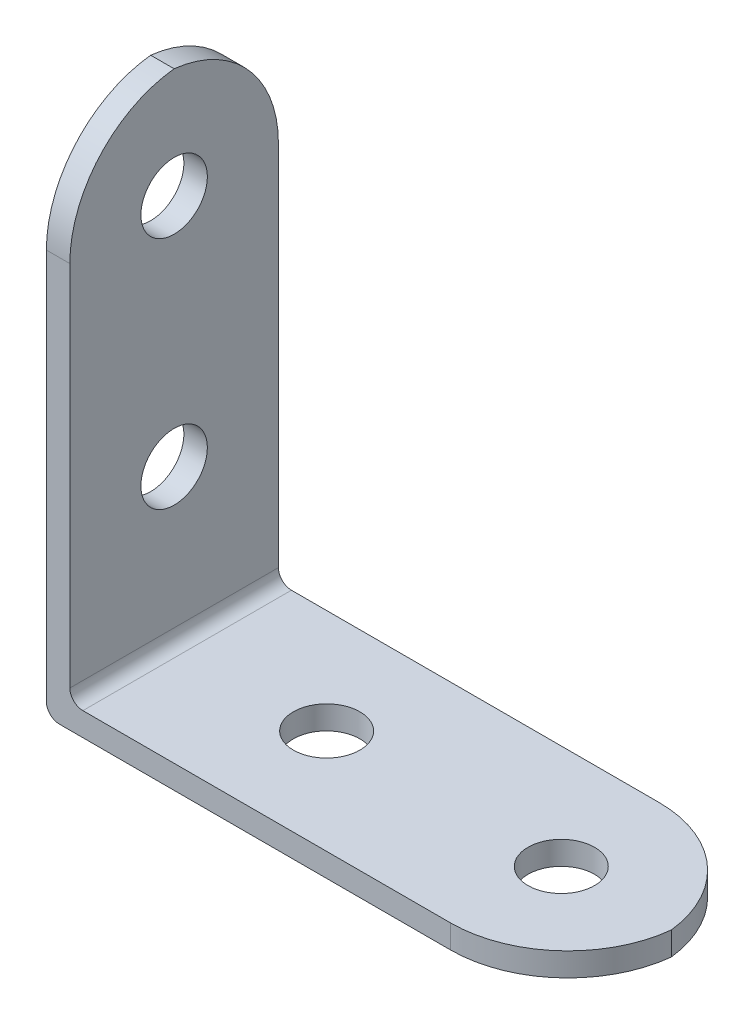
ISO-10303-21;
HEADER;
FILE_DESCRIPTION(('STEP AP214'),'2;1');
FILE_NAME('part.step','',(''),(''),'','','');
FILE_SCHEMA(('AUTOMOTIVE_DESIGN { 1 0 10303 214 1 1 1 1 }'));
ENDSEC;
DATA;
#1=APPLICATION_CONTEXT('core data for automotive mechanical design processes');
#2=APPLICATION_PROTOCOL_DEFINITION('international standard','automotive_design',2000,#1);
#3=PRODUCT_CONTEXT('',#1,'mechanical');
#4=PRODUCT('Part','Part','',(#3));
#5=PRODUCT_RELATED_PRODUCT_CATEGORY('part','',(#4));
#6=PRODUCT_DEFINITION_FORMATION('','',#4);
#7=PRODUCT_DEFINITION_CONTEXT('part definition',#1,'design');
#8=PRODUCT_DEFINITION('design','',#6,#7);
#9=PRODUCT_DEFINITION_SHAPE('','',#8);
#10=(LENGTH_UNIT() NAMED_UNIT(*) SI_UNIT(.MILLI.,.METRE.));
#11=(NAMED_UNIT(*) PLANE_ANGLE_UNIT() SI_UNIT($,.RADIAN.));
#12=(NAMED_UNIT(*) SI_UNIT($,.STERADIAN.) SOLID_ANGLE_UNIT());
#13=UNCERTAINTY_MEASURE_WITH_UNIT(LENGTH_MEASURE(1.E-05),#10,'distance_accuracy_value','');
#14=(GEOMETRIC_REPRESENTATION_CONTEXT(3) GLOBAL_UNCERTAINTY_ASSIGNED_CONTEXT((#13)) GLOBAL_UNIT_ASSIGNED_CONTEXT((#10,
#11,#12)) REPRESENTATION_CONTEXT('',''));
#15=CARTESIAN_POINT('',(0.,0.,0.));
#16=DIRECTION('',(0.,0.,1.));
#17=DIRECTION('',(1.,0.,0.));
#18=AXIS2_PLACEMENT_3D('',#15,#16,#17);
#19=CARTESIAN_POINT('',(1.8,0.,0.));
#20=DIRECTION('',(1.,0.,0.));
#21=DIRECTION('',(0.,0.,-1.));
#22=AXIS2_PLACEMENT_3D('',#19,#20,#21);
#23=PLANE('',#22);
#24=DIRECTION('',(0.,1.,0.));
#25=VECTOR('',#24,1.);
#26=CARTESIAN_POINT('',(1.8,0.,0.));
#27=LINE('',#26,#25);
#28=CARTESIAN_POINT('',(1.8,2.8,0.));
#29=VERTEX_POINT('',#28);
#30=CARTESIAN_POINT('',(1.8,31.,0.));
#31=VERTEX_POINT('',#30);
#32=EDGE_CURVE('E195',#29,#31,#27,.T.);
#33=ORIENTED_EDGE('',*,*,#32,.T.);
#34=CARTESIAN_POINT('',(1.8,31.,9.));
#35=DIRECTION('',(1.,0.,0.));
#36=DIRECTION('',(0.,0.,-1.));
#37=AXIS2_PLACEMENT_3D('',#34,#35,#36);
#38=CIRCLE('',#37,9.);
#39=CARTESIAN_POINT('',(1.8,39.9442719099992,8.));
#40=VERTEX_POINT('',#39);
#41=EDGE_CURVE('E173',#31,#40,#38,.T.);
#42=ORIENTED_EDGE('',*,*,#41,.T.);
#43=CARTESIAN_POINT('',(1.8,31.,7.));
#44=DIRECTION('',(1.,0.,0.));
#45=DIRECTION('',(0.,0.,-1.));
#46=AXIS2_PLACEMENT_3D('',#43,#44,#45);
#47=CIRCLE('',#46,9.);
#48=CARTESIAN_POINT('',(1.8,31.,16.));
#49=VERTEX_POINT('',#48);
#50=EDGE_CURVE('E171',#40,#49,#47,.T.);
#51=ORIENTED_EDGE('',*,*,#50,.T.);
#52=DIRECTION('',(0.,-1.,0.));
#53=VECTOR('',#52,1.);
#54=CARTESIAN_POINT('',(1.8,0.,16.));
#55=LINE('',#54,#53);
#56=CARTESIAN_POINT('',(1.8,2.8,16.));
#57=VERTEX_POINT('',#56);
#58=EDGE_CURVE('E194',#49,#57,#55,.T.);
#59=ORIENTED_EDGE('',*,*,#58,.T.);
#60=DIRECTION('',(0.,0.,1.));
#61=VECTOR('',#60,1.);
#62=CARTESIAN_POINT('',(1.8,2.8,0.));
#63=LINE('',#62,#61);
#64=EDGE_CURVE('E135',#57,#29,#63,.F.);
#65=ORIENTED_EDGE('',*,*,#64,.T.);
#66=EDGE_LOOP('',(#33,#42,#51,#59,#65));
#67=FACE_BOUND('',#66,.T.);
#68=CARTESIAN_POINT('',(1.8,31.5,8.));
#69=DIRECTION('',(1.,0.,0.));
#70=DIRECTION('',(0.,0.,-1.));
#71=AXIS2_PLACEMENT_3D('',#68,#69,#70);
#72=CIRCLE('',#71,2.55);
#73=CARTESIAN_POINT('',(1.8,31.5,5.45));
#74=VERTEX_POINT('',#73);
#75=EDGE_CURVE('E201',#74,#74,#72,.T.);
#76=ORIENTED_EDGE('',*,*,#75,.F.);
#77=EDGE_LOOP('',(#76));
#78=FACE_BOUND('',#77,.T.);
#79=CARTESIAN_POINT('',(1.8,13.5,8.));
#80=DIRECTION('',(1.,0.,0.));
#81=DIRECTION('',(0.,0.,-1.));
#82=AXIS2_PLACEMENT_3D('',#79,#80,#81);
#83=CIRCLE('',#82,2.55);
#84=CARTESIAN_POINT('',(1.8,13.5,5.45));
#85=VERTEX_POINT('',#84);
#86=EDGE_CURVE('E208',#85,#85,#83,.T.);
#87=ORIENTED_EDGE('',*,*,#86,.F.);
#88=EDGE_LOOP('',(#87));
#89=FACE_BOUND('',#88,.T.);
#90=ADVANCED_FACE('F39',(#67,#78,#89),#23,.T.);
#91=CARTESIAN_POINT('',(0.,0.,0.));
#92=DIRECTION('',(1.,0.,0.));
#93=DIRECTION('',(0.,0.,-1.));
#94=AXIS2_PLACEMENT_3D('',#91,#92,#93);
#95=PLANE('',#94);
#96=DIRECTION('',(0.,1.,0.));
#97=VECTOR('',#96,1.);
#98=CARTESIAN_POINT('',(0.,0.,0.));
#99=LINE('',#98,#97);
#100=CARTESIAN_POINT('',(0.,1.,0.));
#101=VERTEX_POINT('',#100);
#102=CARTESIAN_POINT('',(0.,31.,0.));
#103=VERTEX_POINT('',#102);
#104=EDGE_CURVE('E200',#101,#103,#99,.T.);
#105=ORIENTED_EDGE('',*,*,#104,.F.);
#106=DIRECTION('',(0.,0.,-1.));
#107=VECTOR('',#106,1.);
#108=CARTESIAN_POINT('',(0.,1.,0.));
#109=LINE('',#108,#107);
#110=CARTESIAN_POINT('',(0.,1.,16.));
#111=VERTEX_POINT('',#110);
#112=EDGE_CURVE('E47',#101,#111,#109,.F.);
#113=ORIENTED_EDGE('',*,*,#112,.T.);
#114=DIRECTION('',(0.,-1.,0.));
#115=VECTOR('',#114,1.);
#116=CARTESIAN_POINT('',(0.,0.,16.));
#117=LINE('',#116,#115);
#118=CARTESIAN_POINT('',(0.,31.,16.));
#119=VERTEX_POINT('',#118);
#120=EDGE_CURVE('E198',#119,#111,#117,.T.);
#121=ORIENTED_EDGE('',*,*,#120,.F.);
#122=CARTESIAN_POINT('',(0.,31.,7.));
#123=DIRECTION('',(1.,0.,0.));
#124=DIRECTION('',(0.,0.,-1.));
#125=AXIS2_PLACEMENT_3D('',#122,#123,#124);
#126=CIRCLE('',#125,9.);
#127=CARTESIAN_POINT('',(0.,39.9442719099992,8.));
#128=VERTEX_POINT('',#127);
#129=EDGE_CURVE('E166',#119,#128,#126,.F.);
#130=ORIENTED_EDGE('',*,*,#129,.T.);
#131=CARTESIAN_POINT('',(0.,31.,9.));
#132=DIRECTION('',(1.,0.,0.));
#133=DIRECTION('',(0.,0.,-1.));
#134=AXIS2_PLACEMENT_3D('',#131,#132,#133);
#135=CIRCLE('',#134,9.);
#136=EDGE_CURVE('E168',#128,#103,#135,.F.);
#137=ORIENTED_EDGE('',*,*,#136,.T.);
#138=EDGE_LOOP('',(#105,#113,#121,#130,#137));
#139=FACE_BOUND('',#138,.T.);
#140=CARTESIAN_POINT('',(0.,31.5,8.));
#141=DIRECTION('',(1.,0.,0.));
#142=DIRECTION('',(0.,0.,-1.));
#143=AXIS2_PLACEMENT_3D('',#140,#141,#142);
#144=CIRCLE('',#143,2.55);
#145=CARTESIAN_POINT('',(0.,31.5,5.45));
#146=VERTEX_POINT('',#145);
#147=EDGE_CURVE('E205',#146,#146,#144,.T.);
#148=ORIENTED_EDGE('',*,*,#147,.T.);
#149=EDGE_LOOP('',(#148));
#150=FACE_BOUND('',#149,.T.);
#151=CARTESIAN_POINT('',(0.,13.5,8.));
#152=DIRECTION('',(1.,0.,0.));
#153=DIRECTION('',(0.,0.,-1.));
#154=AXIS2_PLACEMENT_3D('',#151,#152,#153);
#155=CIRCLE('',#154,2.55);
#156=CARTESIAN_POINT('',(0.,13.5,5.45));
#157=VERTEX_POINT('',#156);
#158=EDGE_CURVE('E211',#157,#157,#155,.T.);
#159=ORIENTED_EDGE('',*,*,#158,.T.);
#160=EDGE_LOOP('',(#159));
#161=FACE_BOUND('',#160,.T.);
#162=ADVANCED_FACE('F257',(#139,#150,#161),#95,.F.);
#163=CARTESIAN_POINT('',(1.8,0.,0.));
#164=DIRECTION('',(0.,0.,1.));
#165=DIRECTION('',(0.,-1.,0.));
#166=AXIS2_PLACEMENT_3D('',#163,#164,#165);
#167=PLANE('',#166);
#168=DIRECTION('',(-1.,0.,0.));
#169=VECTOR('',#168,1.);
#170=CARTESIAN_POINT('',(1.8,0.,0.));
#171=LINE('',#170,#169);
#172=CARTESIAN_POINT('',(31.,0.,0.));
#173=VERTEX_POINT('',#172);
#174=CARTESIAN_POINT('',(1.,0.,0.));
#175=VERTEX_POINT('',#174);
#176=EDGE_CURVE('E145',#173,#175,#171,.T.);
#177=ORIENTED_EDGE('',*,*,#176,.T.);
#178=CARTESIAN_POINT('',(1.,1.,0.));
#179=DIRECTION('',(0.,0.,1.));
#180=DIRECTION('',(0.,-1.,0.));
#181=AXIS2_PLACEMENT_3D('',#178,#179,#180);
#182=CIRCLE('',#181,1.);
#183=EDGE_CURVE('E61',#175,#101,#182,.F.);
#184=ORIENTED_EDGE('',*,*,#183,.T.);
#185=ORIENTED_EDGE('',*,*,#104,.T.);
#186=DIRECTION('',(-1.,0.,0.));
#187=VECTOR('',#186,1.);
#188=CARTESIAN_POINT('',(1.8,31.,0.));
#189=LINE('',#188,#187);
#190=EDGE_CURVE('E161',#103,#31,#189,.F.);
#191=ORIENTED_EDGE('',*,*,#190,.T.);
#192=ORIENTED_EDGE('',*,*,#32,.F.);
#193=CARTESIAN_POINT('',(2.8,2.8,0.));
#194=DIRECTION('',(0.,0.,1.));
#195=DIRECTION('',(0.,-1.,0.));
#196=AXIS2_PLACEMENT_3D('',#193,#194,#195);
#197=CIRCLE('',#196,1.);
#198=CARTESIAN_POINT('',(2.8,1.8,0.));
#199=VERTEX_POINT('',#198);
#200=EDGE_CURVE('E136',#29,#199,#197,.T.);
#201=ORIENTED_EDGE('',*,*,#200,.T.);
#202=DIRECTION('',(-1.,0.,0.));
#203=VECTOR('',#202,1.);
#204=CARTESIAN_POINT('',(40.,1.8,0.));
#205=LINE('',#204,#203);
#206=CARTESIAN_POINT('',(31.,1.8,0.));
#207=VERTEX_POINT('',#206);
#208=EDGE_CURVE('E127',#207,#199,#205,.T.);
#209=ORIENTED_EDGE('',*,*,#208,.F.);
#210=DIRECTION('',(0.,1.,0.));
#211=VECTOR('',#210,1.);
#212=CARTESIAN_POINT('',(31.,0.,0.));
#213=LINE('',#212,#211);
#214=EDGE_CURVE('E164',#207,#173,#213,.F.);
#215=ORIENTED_EDGE('',*,*,#214,.T.);
#216=EDGE_LOOP('',(#177,#184,#185,#191,#192,#201,#209,#215));
#217=FACE_BOUND('',#216,.T.);
#218=ADVANCED_FACE('F192',(#217),#167,.F.);
#219=CARTESIAN_POINT('',(1.8,0.,16.));
#220=DIRECTION('',(0.,0.,-1.));
#221=DIRECTION('',(-1.,0.,0.));
#222=AXIS2_PLACEMENT_3D('',#219,#220,#221);
#223=PLANE('',#222);
#224=ORIENTED_EDGE('',*,*,#120,.T.);
#225=CARTESIAN_POINT('',(1.,1.,16.));
#226=DIRECTION('',(0.,0.,-1.));
#227=DIRECTION('',(-1.,0.,0.));
#228=AXIS2_PLACEMENT_3D('',#225,#226,#227);
#229=CIRCLE('',#228,1.);
#230=CARTESIAN_POINT('',(1.,0.,16.));
#231=VERTEX_POINT('',#230);
#232=EDGE_CURVE('E11',#111,#231,#229,.F.);
#233=ORIENTED_EDGE('',*,*,#232,.T.);
#234=DIRECTION('',(-1.,0.,0.));
#235=VECTOR('',#234,1.);
#236=CARTESIAN_POINT('',(1.8,0.,16.));
#237=LINE('',#236,#235);
#238=CARTESIAN_POINT('',(31.,0.,16.));
#239=VERTEX_POINT('',#238);
#240=EDGE_CURVE('E141',#239,#231,#237,.T.);
#241=ORIENTED_EDGE('',*,*,#240,.F.);
#242=DIRECTION('',(0.,-1.,0.));
#243=VECTOR('',#242,1.);
#244=CARTESIAN_POINT('',(31.,0.,16.));
#245=LINE('',#244,#243);
#246=CARTESIAN_POINT('',(31.,1.8,16.));
#247=VERTEX_POINT('',#246);
#248=EDGE_CURVE('E124',#239,#247,#245,.F.);
#249=ORIENTED_EDGE('',*,*,#248,.T.);
#250=DIRECTION('',(-1.,0.,0.));
#251=VECTOR('',#250,1.);
#252=CARTESIAN_POINT('',(40.,1.8,16.));
#253=LINE('',#252,#251);
#254=CARTESIAN_POINT('',(2.8,1.8,16.));
#255=VERTEX_POINT('',#254);
#256=EDGE_CURVE('E116',#247,#255,#253,.T.);
#257=ORIENTED_EDGE('',*,*,#256,.T.);
#258=CARTESIAN_POINT('',(2.8,2.8,16.));
#259=DIRECTION('',(0.,0.,-1.));
#260=DIRECTION('',(-1.,0.,0.));
#261=AXIS2_PLACEMENT_3D('',#258,#259,#260);
#262=CIRCLE('',#261,1.);
#263=EDGE_CURVE('E120',#255,#57,#262,.T.);
#264=ORIENTED_EDGE('',*,*,#263,.T.);
#265=ORIENTED_EDGE('',*,*,#58,.F.);
#266=DIRECTION('',(-1.,0.,0.));
#267=VECTOR('',#266,1.);
#268=CARTESIAN_POINT('',(1.8,31.,16.));
#269=LINE('',#268,#267);
#270=EDGE_CURVE('E154',#49,#119,#269,.T.);
#271=ORIENTED_EDGE('',*,*,#270,.T.);
#272=EDGE_LOOP('',(#224,#233,#241,#249,#257,#264,#265,#271));
#273=FACE_BOUND('',#272,.T.);
#274=ADVANCED_FACE('F118',(#273),#223,.F.);
#275=CARTESIAN_POINT('',(1.8,0.,0.));
#276=DIRECTION('',(0.,1.,0.));
#277=DIRECTION('',(0.,0.,1.));
#278=AXIS2_PLACEMENT_3D('',#275,#276,#277);
#279=PLANE('',#278);
#280=CARTESIAN_POINT('',(31.5,0.,8.));
#281=DIRECTION('',(0.,1.,0.));
#282=DIRECTION('',(0.,0.,1.));
#283=AXIS2_PLACEMENT_3D('',#280,#281,#282);
#284=CIRCLE('',#283,2.55);
#285=CARTESIAN_POINT('',(31.5,0.,10.55));
#286=VERTEX_POINT('',#285);
#287=EDGE_CURVE('E128',#286,#286,#284,.T.);
#288=ORIENTED_EDGE('',*,*,#287,.T.);
#289=EDGE_LOOP('',(#288));
#290=FACE_BOUND('',#289,.T.);
#291=CARTESIAN_POINT('',(13.5,0.,8.));
#292=DIRECTION('',(0.,1.,0.));
#293=DIRECTION('',(0.,0.,1.));
#294=AXIS2_PLACEMENT_3D('',#291,#292,#293);
#295=CIRCLE('',#294,2.55);
#296=CARTESIAN_POINT('',(13.5,0.,10.55));
#297=VERTEX_POINT('',#296);
#298=EDGE_CURVE('E219',#297,#297,#295,.T.);
#299=ORIENTED_EDGE('',*,*,#298,.T.);
#300=EDGE_LOOP('',(#299));
#301=FACE_BOUND('',#300,.T.);
#302=ORIENTED_EDGE('',*,*,#240,.T.);
#303=DIRECTION('',(0.,0.,-1.));
#304=VECTOR('',#303,1.);
#305=CARTESIAN_POINT('',(1.,0.,0.));
#306=LINE('',#305,#304);
#307=EDGE_CURVE('E175',#231,#175,#306,.T.);
#308=ORIENTED_EDGE('',*,*,#307,.T.);
#309=ORIENTED_EDGE('',*,*,#176,.F.);
#310=CARTESIAN_POINT('',(31.,0.,9.));
#311=DIRECTION('',(0.,1.,0.));
#312=DIRECTION('',(0.,0.,1.));
#313=AXIS2_PLACEMENT_3D('',#310,#311,#312);
#314=CIRCLE('',#313,9.);
#315=CARTESIAN_POINT('',(39.9442719099992,0.,8.));
#316=VERTEX_POINT('',#315);
#317=EDGE_CURVE('E150',#173,#316,#314,.F.);
#318=ORIENTED_EDGE('',*,*,#317,.T.);
#319=CARTESIAN_POINT('',(31.,0.,7.));
#320=DIRECTION('',(0.,1.,0.));
#321=DIRECTION('',(0.,0.,1.));
#322=AXIS2_PLACEMENT_3D('',#319,#320,#321);
#323=CIRCLE('',#322,9.);
#324=EDGE_CURVE('E152',#316,#239,#323,.F.);
#325=ORIENTED_EDGE('',*,*,#324,.T.);
#326=EDGE_LOOP('',(#302,#308,#309,#318,#325));
#327=FACE_BOUND('',#326,.T.);
#328=ADVANCED_FACE('F188',(#290,#301,#327),#279,.F.);
#329=CARTESIAN_POINT('',(1.8,31.5,8.));
#330=DIRECTION('',(-1.,0.,0.));
#331=DIRECTION('',(0.,0.,1.));
#332=AXIS2_PLACEMENT_3D('',#329,#330,#331);
#333=CYLINDRICAL_SURFACE('',#332,2.55);
#334=ORIENTED_EDGE('',*,*,#75,.T.);
#335=EDGE_LOOP('',(#334));
#336=FACE_BOUND('',#335,.T.);
#337=ORIENTED_EDGE('',*,*,#147,.F.);
#338=EDGE_LOOP('',(#337));
#339=FACE_BOUND('',#338,.T.);
#340=ADVANCED_FACE('F244',(#336,#339),#333,.F.);
#341=CARTESIAN_POINT('',(1.8,13.5,8.));
#342=DIRECTION('',(-1.,0.,0.));
#343=DIRECTION('',(0.,0.,1.));
#344=AXIS2_PLACEMENT_3D('',#341,#342,#343);
#345=CYLINDRICAL_SURFACE('',#344,2.55);
#346=ORIENTED_EDGE('',*,*,#86,.T.);
#347=EDGE_LOOP('',(#346));
#348=FACE_BOUND('',#347,.T.);
#349=ORIENTED_EDGE('',*,*,#158,.F.);
#350=EDGE_LOOP('',(#349));
#351=FACE_BOUND('',#350,.T.);
#352=ADVANCED_FACE('F234',(#348,#351),#345,.F.);
#353=CARTESIAN_POINT('',(40.,1.8,16.));
#354=DIRECTION('',(0.,-1.,0.));
#355=DIRECTION('',(0.,0.,-1.));
#356=AXIS2_PLACEMENT_3D('',#353,#354,#355);
#357=PLANE('',#356);
#358=CARTESIAN_POINT('',(31.5,1.8,8.));
#359=DIRECTION('',(0.,1.,0.));
#360=DIRECTION('',(0.,0.,1.));
#361=AXIS2_PLACEMENT_3D('',#358,#359,#360);
#362=CIRCLE('',#361,2.55);
#363=CARTESIAN_POINT('',(31.5,1.8,10.55));
#364=VERTEX_POINT('',#363);
#365=EDGE_CURVE('E222',#364,#364,#362,.T.);
#366=ORIENTED_EDGE('',*,*,#365,.F.);
#367=EDGE_LOOP('',(#366));
#368=FACE_BOUND('',#367,.T.);
#369=CARTESIAN_POINT('',(13.5,1.8,8.));
#370=DIRECTION('',(0.,1.,0.));
#371=DIRECTION('',(0.,0.,1.));
#372=AXIS2_PLACEMENT_3D('',#369,#370,#371);
#373=CIRCLE('',#372,2.55);
#374=CARTESIAN_POINT('',(13.5,1.8,10.55));
#375=VERTEX_POINT('',#374);
#376=EDGE_CURVE('E179',#375,#375,#373,.T.);
#377=ORIENTED_EDGE('',*,*,#376,.F.);
#378=EDGE_LOOP('',(#377));
#379=FACE_BOUND('',#378,.T.);
#380=ORIENTED_EDGE('',*,*,#256,.F.);
#381=CARTESIAN_POINT('',(31.,1.8,7.));
#382=DIRECTION('',(0.,-1.,0.));
#383=DIRECTION('',(0.,0.,-1.));
#384=AXIS2_PLACEMENT_3D('',#381,#382,#383);
#385=CIRCLE('',#384,9.);
#386=CARTESIAN_POINT('',(39.9442719099992,1.8,8.));
#387=VERTEX_POINT('',#386);
#388=EDGE_CURVE('E159',#247,#387,#385,.F.);
#389=ORIENTED_EDGE('',*,*,#388,.T.);
#390=CARTESIAN_POINT('',(31.,1.8,9.));
#391=DIRECTION('',(0.,-1.,0.));
#392=DIRECTION('',(0.,0.,-1.));
#393=AXIS2_PLACEMENT_3D('',#390,#391,#392);
#394=CIRCLE('',#393,9.);
#395=EDGE_CURVE('E157',#387,#207,#394,.F.);
#396=ORIENTED_EDGE('',*,*,#395,.T.);
#397=ORIENTED_EDGE('',*,*,#208,.T.);
#398=DIRECTION('',(0.,0.,1.));
#399=VECTOR('',#398,1.);
#400=CARTESIAN_POINT('',(2.8,1.8,16.));
#401=LINE('',#400,#399);
#402=EDGE_CURVE('E134',#199,#255,#401,.T.);
#403=ORIENTED_EDGE('',*,*,#402,.T.);
#404=EDGE_LOOP('',(#380,#389,#396,#397,#403));
#405=FACE_BOUND('',#404,.T.);
#406=ADVANCED_FACE('F138',(#368,#379,#405),#357,.F.);
#407=CARTESIAN_POINT('',(13.5,-36.4,8.));
#408=DIRECTION('',(0.,1.,0.));
#409=DIRECTION('',(0.,0.,1.));
#410=AXIS2_PLACEMENT_3D('',#407,#408,#409);
#411=CYLINDRICAL_SURFACE('',#410,2.55);
#412=ORIENTED_EDGE('',*,*,#376,.T.);
#413=EDGE_LOOP('',(#412));
#414=FACE_BOUND('',#413,.T.);
#415=ORIENTED_EDGE('',*,*,#298,.F.);
#416=EDGE_LOOP('',(#415));
#417=FACE_BOUND('',#416,.T.);
#418=ADVANCED_FACE('F233',(#414,#417),#411,.F.);
#419=CARTESIAN_POINT('',(31.5,-36.4,8.));
#420=DIRECTION('',(0.,1.,0.));
#421=DIRECTION('',(0.,0.,1.));
#422=AXIS2_PLACEMENT_3D('',#419,#420,#421);
#423=CYLINDRICAL_SURFACE('',#422,2.55);
#424=ORIENTED_EDGE('',*,*,#365,.T.);
#425=EDGE_LOOP('',(#424));
#426=FACE_BOUND('',#425,.T.);
#427=ORIENTED_EDGE('',*,*,#287,.F.);
#428=EDGE_LOOP('',(#427));
#429=FACE_BOUND('',#428,.T.);
#430=ADVANCED_FACE('F228',(#426,#429),#423,.F.);
#431=CARTESIAN_POINT('',(2.8,2.8,16.));
#432=DIRECTION('',(0.,0.,1.));
#433=DIRECTION('',(1.,0.,0.));
#434=AXIS2_PLACEMENT_3D('',#431,#432,#433);
#435=CYLINDRICAL_SURFACE('',#434,1.);
#436=ORIENTED_EDGE('',*,*,#200,.F.);
#437=ORIENTED_EDGE('',*,*,#64,.F.);
#438=ORIENTED_EDGE('',*,*,#263,.F.);
#439=ORIENTED_EDGE('',*,*,#402,.F.);
#440=EDGE_LOOP('',(#436,#437,#438,#439));
#441=FACE_BOUND('',#440,.T.);
#442=ADVANCED_FACE('F133',(#441),#435,.F.);
#443=CARTESIAN_POINT('',(31.,0.,9.));
#444=DIRECTION('',(0.,1.,0.));
#445=DIRECTION('',(0.,0.,1.));
#446=AXIS2_PLACEMENT_3D('',#443,#444,#445);
#447=CYLINDRICAL_SURFACE('',#446,9.);
#448=ORIENTED_EDGE('',*,*,#214,.F.);
#449=ORIENTED_EDGE('',*,*,#395,.F.);
#450=DIRECTION('',(0.,1.,0.));
#451=VECTOR('',#450,1.);
#452=CARTESIAN_POINT('',(39.9442719099992,0.9,8.));
#453=LINE('',#452,#451);
#454=EDGE_CURVE('E176',#316,#387,#453,.T.);
#455=ORIENTED_EDGE('',*,*,#454,.F.);
#456=ORIENTED_EDGE('',*,*,#317,.F.);
#457=EDGE_LOOP('',(#448,#449,#455,#456));
#458=FACE_BOUND('',#457,.T.);
#459=ADVANCED_FACE('F272',(#458),#447,.T.);
#460=CARTESIAN_POINT('',(31.,0.,7.));
#461=DIRECTION('',(0.,-1.,0.));
#462=DIRECTION('',(0.,0.,-1.));
#463=AXIS2_PLACEMENT_3D('',#460,#461,#462);
#464=CYLINDRICAL_SURFACE('',#463,9.);
#465=ORIENTED_EDGE('',*,*,#388,.F.);
#466=ORIENTED_EDGE('',*,*,#248,.F.);
#467=ORIENTED_EDGE('',*,*,#324,.F.);
#468=ORIENTED_EDGE('',*,*,#454,.T.);
#469=EDGE_LOOP('',(#465,#466,#467,#468));
#470=FACE_BOUND('',#469,.T.);
#471=ADVANCED_FACE('F277',(#470),#464,.T.);
#472=CARTESIAN_POINT('',(1.8,31.,7.));
#473=DIRECTION('',(-1.,0.,0.));
#474=DIRECTION('',(0.,0.,1.));
#475=AXIS2_PLACEMENT_3D('',#472,#473,#474);
#476=CYLINDRICAL_SURFACE('',#475,9.);
#477=ORIENTED_EDGE('',*,*,#270,.F.);
#478=ORIENTED_EDGE('',*,*,#50,.F.);
#479=DIRECTION('',(-1.,0.,0.));
#480=VECTOR('',#479,1.);
#481=CARTESIAN_POINT('',(0.9,39.9442719099992,8.));
#482=LINE('',#481,#480);
#483=EDGE_CURVE('E180',#128,#40,#482,.F.);
#484=ORIENTED_EDGE('',*,*,#483,.F.);
#485=ORIENTED_EDGE('',*,*,#129,.F.);
#486=EDGE_LOOP('',(#477,#478,#484,#485));
#487=FACE_BOUND('',#486,.T.);
#488=ADVANCED_FACE('F283',(#487),#476,.T.);
#489=CARTESIAN_POINT('',(1.8,31.,9.));
#490=DIRECTION('',(-1.,0.,0.));
#491=DIRECTION('',(0.,0.,1.));
#492=AXIS2_PLACEMENT_3D('',#489,#490,#491);
#493=CYLINDRICAL_SURFACE('',#492,9.);
#494=ORIENTED_EDGE('',*,*,#41,.F.);
#495=ORIENTED_EDGE('',*,*,#190,.F.);
#496=ORIENTED_EDGE('',*,*,#136,.F.);
#497=ORIENTED_EDGE('',*,*,#483,.T.);
#498=EDGE_LOOP('',(#494,#495,#496,#497));
#499=FACE_BOUND('',#498,.T.);
#500=ADVANCED_FACE('F286',(#499),#493,.T.);
#501=CARTESIAN_POINT('',(1.,1.,0.));
#502=DIRECTION('',(0.,0.,-1.));
#503=DIRECTION('',(-1.,0.,0.));
#504=AXIS2_PLACEMENT_3D('',#501,#502,#503);
#505=CYLINDRICAL_SURFACE('',#504,1.);
#506=ORIENTED_EDGE('',*,*,#232,.F.);
#507=ORIENTED_EDGE('',*,*,#112,.F.);
#508=ORIENTED_EDGE('',*,*,#183,.F.);
#509=ORIENTED_EDGE('',*,*,#307,.F.);
#510=EDGE_LOOP('',(#506,#507,#508,#509));
#511=FACE_BOUND('',#510,.T.);
#512=ADVANCED_FACE('F41',(#511),#505,.T.);
#513=CLOSED_SHELL('',(#90,#162,#218,#274,#328,#340,#352,#406,#418,#430,#442,#459,#471,#488,#500,#512));
#514=MANIFOLD_SOLID_BREP('B2',#513);
#515=ADVANCED_BREP_SHAPE_REPRESENTATION('',(#18,#514),#14);
#516=SHAPE_DEFINITION_REPRESENTATION(#9,#515);
ENDSEC;
END-ISO-10303-21;
